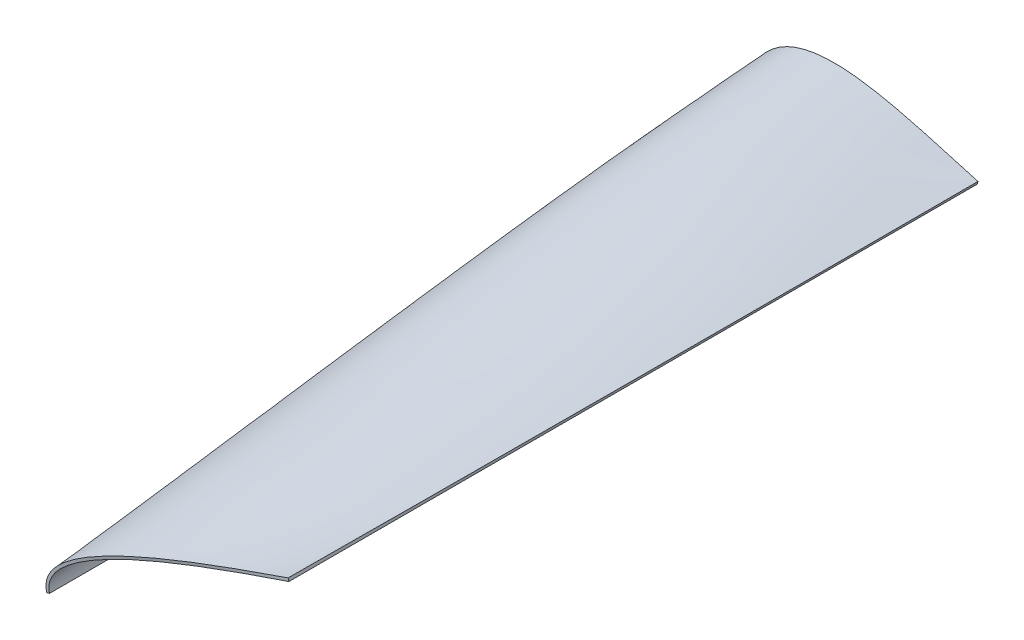
ISO-10303-21;
HEADER;
FILE_DESCRIPTION(('STEP AP214'),'2;1');
FILE_NAME('part.step','',(''),(''),'','','');
FILE_SCHEMA(('AUTOMOTIVE_DESIGN { 1 0 10303 214 1 1 1 1 }'));
ENDSEC;
DATA;
#1=APPLICATION_CONTEXT('core data for automotive mechanical design processes');
#2=APPLICATION_PROTOCOL_DEFINITION('international standard','automotive_design',2000,#1);
#3=PRODUCT_CONTEXT('',#1,'mechanical');
#4=PRODUCT('Part','Part','',(#3));
#5=PRODUCT_RELATED_PRODUCT_CATEGORY('part','',(#4));
#6=PRODUCT_DEFINITION_FORMATION('','',#4);
#7=PRODUCT_DEFINITION_CONTEXT('part definition',#1,'design');
#8=PRODUCT_DEFINITION('design','',#6,#7);
#9=PRODUCT_DEFINITION_SHAPE('','',#8);
#10=(LENGTH_UNIT() NAMED_UNIT(*) SI_UNIT(.MILLI.,.METRE.));
#11=(NAMED_UNIT(*) PLANE_ANGLE_UNIT() SI_UNIT($,.RADIAN.));
#12=(NAMED_UNIT(*) SI_UNIT($,.STERADIAN.) SOLID_ANGLE_UNIT());
#13=UNCERTAINTY_MEASURE_WITH_UNIT(LENGTH_MEASURE(1.E-05),#10,'distance_accuracy_value','');
#14=(GEOMETRIC_REPRESENTATION_CONTEXT(3) GLOBAL_UNCERTAINTY_ASSIGNED_CONTEXT((#13)) GLOBAL_UNIT_ASSIGNED_CONTEXT((#10,
#11,#12)) REPRESENTATION_CONTEXT('',''));
#15=CARTESIAN_POINT('',(0.,0.,0.));
#16=DIRECTION('',(0.,0.,1.));
#17=DIRECTION('',(1.,0.,0.));
#18=AXIS2_PLACEMENT_3D('',#15,#16,#17);
#19=CARTESIAN_POINT('',(-21.5703543383679,142.147271521122,-302.666399976954));
#20=CARTESIAN_POINT('',(-34.6379442944919,145.778481945039,-302.68171919842));
#21=CARTESIAN_POINT('',(-47.8984481119462,149.691166324391,-302.684402516985));
#22=CARTESIAN_POINT('',(-74.2739086479034,157.086445241003,-302.672750535291));
#23=CARTESIAN_POINT('',(-87.3885010336553,160.569144384547,-302.658346675289));
#24=CARTESIAN_POINT('',(-112.958912081565,166.104165839594,-302.619355876478));
#25=CARTESIAN_POINT('',(-125.414755291034,168.157643668795,-302.594584727172));
#26=CARTESIAN_POINT('',(-149.179131065414,169.810812837228,-302.543688904268));
#27=CARTESIAN_POINT('',(-160.49202638516,169.412318356151,-302.517212198902));
#28=CARTESIAN_POINT('',(-176.221440925477,166.149995853284,-302.491011368182));
#29=CARTESIAN_POINT('',(-181.257265517725,164.617264562291,-302.48470924615));
#30=CARTESIAN_POINT('',(-190.828711132257,160.521558617791,-302.480157210323));
#31=CARTESIAN_POINT('',(-195.363849835058,157.957925657709,-302.482019186262));
#32=CARTESIAN_POINT('',(-203.831139943577,151.679078878156,-302.494653391624));
#33=CARTESIAN_POINT('',(-207.762220303913,147.964287289859,-302.505405681162));
#34=CARTESIAN_POINT('',(-214.927434255557,139.289200302421,-302.532090198507));
#35=CARTESIAN_POINT('',(-218.161614709029,134.329903135347,-302.54787769888));
#36=CARTESIAN_POINT('',(-223.868648680616,123.073231982809,-302.579238773807));
#37=CARTESIAN_POINT('',(-226.342177363842,116.77597896544,-302.594762492178));
#38=CARTESIAN_POINT('',(-230.478364929651,102.731699743051,-302.622122827371));
#39=CARTESIAN_POINT('',(-232.141315772318,94.9843557699155,-302.633987501816));
#40=CARTESIAN_POINT('',(-235.836099909466,69.3796487371145,-302.661867888903));
#41=CARTESIAN_POINT('',(-236.575949617947,49.1588455525814,-302.670119397055));
#42=CARTESIAN_POINT('',(-235.353078570593,25.2699943249526,-302.666399976954));
#43=CARTESIAN_POINT('',(-22.2504000000002,139.7,-302.666399976954));
#44=CARTESIAN_POINT('',(-35.3441000000002,143.338465859985,-302.666399976954));
#45=CARTESIAN_POINT('',(-48.6065252150002,147.251806536714,-302.666399976954));
#46=CARTESIAN_POINT('',(-74.9372712261601,154.634490264004,-302.666399976954));
#47=CARTESIAN_POINT('',(-88.0055920223201,158.103833314565,-302.666399976954));
#48=CARTESIAN_POINT('',(-113.41657434696,163.604774529859,-302.666399976954));
#49=CARTESIAN_POINT('',(-125.75923587544,165.636372694592,-302.666399976954));
#50=CARTESIAN_POINT('',(-149.18734481588,167.268076878574,-302.666399976954));
#51=CARTESIAN_POINT('',(-160.272792227839,166.868182897823,-302.666399976954));
#52=CARTESIAN_POINT('',(-175.559386621759,163.699412372838,-302.666399976954));
#53=CARTESIAN_POINT('',(-180.431321965729,162.215000605533,-302.666399976954));
#54=CARTESIAN_POINT('',(-189.661556056224,158.265648812181,-302.666399976954));
#55=CARTESIAN_POINT('',(-194.019854802749,155.800708786133,-302.666399976954));
#56=CARTESIAN_POINT('',(-202.156371342248,149.766082067838,-302.666399976954));
#57=CARTESIAN_POINT('',(-205.934589135223,146.19639537559,-302.666399976954));
#58=CARTESIAN_POINT('',(-212.844499411518,137.828056917436,-302.666399976954));
#59=CARTESIAN_POINT('',(-215.976191894838,133.029405151531,-302.666399976954));
#60=CARTESIAN_POINT('',(-221.526607195717,122.078918138604,-302.666399976954));
#61=CARTESIAN_POINT('',(-223.945330013277,115.927082891584,-302.666399976954));
#62=CARTESIAN_POINT('',(-228.003361626532,102.146010508971,-302.666399976954));
#63=CARTESIAN_POINT('',(-229.642670422226,94.5167733733782,-302.666399976954));
#64=CARTESIAN_POINT('',(-233.291809242356,69.2266315225561,-302.666399976954));
#65=CARTESIAN_POINT('',(-234.032851699835,49.1632963632824,-302.666399976954));
#66=CARTESIAN_POINT('',(-232.816399976954,25.3998469821209,-302.666399976954));
#67=B_SPLINE_SURFACE_WITH_KNOTS('',1,3,((#19,#20,#21,#22,#23,#24,#25,#26,#27,#28,#29,#30,#31,
#32,#33,#34,#35,#36,#37,#38,#39,#40,#41,#42),(#43,#44,#45,#46,#47,#48,#49,#50,#51,#52,#53,#54,
#55,#56,#57,#58,#59,#60,#61,#62,#63,#64,#65,#66)),.UNSPECIFIED.,.F.,.F.,.F.,(2,2),(4,2,2,2,2,2,
2,2,2,2,2,4),(0.,1.),(0.,0.125,0.25,0.375,0.5,0.5625,0.625,0.6875,0.75,0.8125,0.875,1.),.UNSPECIFIED.);
#68=CARTESIAN_POINT('',(-232.816399976954,25.3998469821209,-302.666399976954));
#69=CARTESIAN_POINT('',(-235.353078570593,25.2699943249526,-302.666399976954));
#70=B_SPLINE_CURVE_WITH_KNOTS('',1,(#68,#69),.UNSPECIFIED.,.F.,.F.,(2,2),(0.,1.),.UNSPECIFIED.);
#71=CARTESIAN_POINT('',(-232.816399976954,25.3998469821209,-302.666399976954));
#72=VERTEX_POINT('',#71);
#73=CARTESIAN_POINT('',(-235.353078570591,25.2699943249053,-302.666399673481));
#74=VERTEX_POINT('',#73);
#75=EDGE_CURVE('E11',#72,#74,#70,.T.);
#76=CARTESIAN_POINT('',(-21.570354338229,142.147271521084,-302.666399976954));
#77=CARTESIAN_POINT('',(-28.1515271689582,143.976495440068,-302.674030743129));
#78=CARTESIAN_POINT('',(-34.7179403141286,145.857867430173,-302.678530870977));
#79=CARTESIAN_POINT('',(-47.8807085986818,149.637466294367,-302.682279540574));
#80=CARTESIAN_POINT('',(-54.477053098822,151.535730599531,-302.681502288455));
#81=CARTESIAN_POINT('',(-64.3735236202122,154.310515937094,-302.677121266817));
#82=CARTESIAN_POINT('',(-67.6640308473868,155.221046226294,-302.675134462465));
#83=CARTESIAN_POINT('',(-74.2279956559938,156.999467682348,-302.670189643876));
#84=CARTESIAN_POINT('',(-77.5013755074153,157.867644441551,-302.667239625186));
#85=CARTESIAN_POINT('',(-84.0231229646975,159.545557774948,-302.660477457022));
#86=CARTESIAN_POINT('',(-87.2713465844829,160.355850615066,-302.656675588521));
#87=CARTESIAN_POINT('',(-93.734924049595,161.902038056736,-302.648314306751));
#88=CARTESIAN_POINT('',(-96.9500560265794,162.638853747675,-302.643766894493));
#89=CARTESIAN_POINT('',(-103.339707411993,164.021977449154,-302.634023565075));
#90=CARTESIAN_POINT('',(-106.513924864185,164.669668396209,-302.628840699683));
#91=CARTESIAN_POINT('',(-112.814103208744,165.858241876281,-302.617942992689));
#92=CARTESIAN_POINT('',(-115.939693754174,166.401066559901,-302.612241465553));
#93=CARTESIAN_POINT('',(-122.135099721653,167.363382830458,-302.600436705182));
#94=CARTESIAN_POINT('',(-125.204505973749,167.785466272987,-302.594346014904));
#95=CARTESIAN_POINT('',(-131.279974076491,168.489490359195,-302.581915687265));
#96=CARTESIAN_POINT('',(-134.285644985696,168.774743294921,-302.575586420472));
#97=CARTESIAN_POINT('',(-140.226475467274,169.188025057428,-302.562862337231));
#98=CARTESIAN_POINT('',(-143.161333592877,169.320112683413,-302.556473967145));
#99=CARTESIAN_POINT('',(-147.534810427815,169.387611388077,-302.546952408716));
#100=CARTESIAN_POINT('',(-148.972523858132,169.388997566286,-302.543822066505));
#101=CARTESIAN_POINT('',(-151.827264697004,169.346448898251,-302.537638708782));
#102=CARTESIAN_POINT('',(-153.244300555704,169.30314679562,-302.53458522391));
#103=CARTESIAN_POINT('',(-156.056653818734,169.16905786836,-302.52859302251));
#104=CARTESIAN_POINT('',(-157.452002184418,169.078931464787,-302.525653305647));
#105=CARTESIAN_POINT('',(-160.219964954326,168.848995232738,-302.519930417883));
#106=CARTESIAN_POINT('',(-161.592634875499,168.709862214356,-302.517145684809));
#107=CARTESIAN_POINT('',(-164.314174286263,168.37970816483,-302.511778450989));
#108=CARTESIAN_POINT('',(-165.663125323643,168.189365119325,-302.509193839199));
#109=CARTESIAN_POINT('',(-168.336115420328,167.754582402514,-302.504276137281));
#110=CARTESIAN_POINT('',(-169.660261154756,167.51080291948,-302.501940454236));
#111=CARTESIAN_POINT('',(-172.282470782136,166.966947877111,-302.497572611923));
#112=CARTESIAN_POINT('',(-173.580662501815,166.667491893142,-302.49553751658));
#113=CARTESIAN_POINT('',(-176.149729078587,166.010108652929,-302.491824125044));
#114=CARTESIAN_POINT('',(-177.420744770808,165.652734133805,-302.490142771278));
#115=CARTESIAN_POINT('',(-179.934155116276,164.877381347602,-302.487189306491));
#116=CARTESIAN_POINT('',(-181.176690311789,164.459860259684,-302.485914322585));
#117=CARTESIAN_POINT('',(-183.631764178,163.562148500975,-302.483822430741));
#118=CARTESIAN_POINT('',(-184.844423878043,163.082289718913,-302.483003210374));
#119=CARTESIAN_POINT('',(-187.238318106274,162.057917608076,-302.481864784333));
#120=CARTESIAN_POINT('',(-188.419628611865,161.513582262926,-302.481544235194));
#121=CARTESIAN_POINT('',(-190.749319355954,160.358404705273,-302.481434479016));
#122=CARTESIAN_POINT('',(-191.897699115007,159.747561525091,-302.48164527971));
#123=CARTESIAN_POINT('',(-194.160117201985,158.457548175063,-302.482615943485));
#124=CARTESIAN_POINT('',(-195.27404263644,157.778179253331,-302.48337744566));
#125=CARTESIAN_POINT('',(-196.915102663379,156.708627531018,-302.484928671714));
#126=CARTESIAN_POINT('',(-197.458287905111,156.34285192244,-302.485515616226));
#127=CARTESIAN_POINT('',(-198.535491727498,155.593598447607,-302.48682522678));
#128=CARTESIAN_POINT('',(-199.06946615997,155.210056955029,-302.487548414543));
#129=CARTESIAN_POINT('',(-200.128033884898,154.425086116746,-302.489127908739));
#130=CARTESIAN_POINT('',(-200.652570510838,154.023580399951,-302.489984831678));
#131=CARTESIAN_POINT('',(-201.692085008512,153.202488276479,-302.491827947993));
#132=CARTESIAN_POINT('',(-202.206992753349,152.782813078617,-302.49281483956));
#133=CARTESIAN_POINT('',(-203.22706769484,151.925198790868,-302.494912953808));
#134=CARTESIAN_POINT('',(-203.732150273524,151.487159068631,-302.496024939885));
#135=CARTESIAN_POINT('',(-204.732401013345,150.592636753696,-302.498367241742));
#136=CARTESIAN_POINT('',(-205.227469218151,150.136042408783,-302.499598365994));
#137=CARTESIAN_POINT('',(-206.207523342109,149.204235730809,-302.5021719766));
#138=CARTESIAN_POINT('',(-206.692393249105,148.728901401675,-302.503515293589));
#139=CARTESIAN_POINT('',(-207.651888789819,147.759444597161,-302.506305455061));
#140=CARTESIAN_POINT('',(-208.12638179478,147.265190909894,-302.507753127305));
#141=CARTESIAN_POINT('',(-209.064973310508,146.257719621587,-302.510743440321));
#142=CARTESIAN_POINT('',(-209.52892224436,145.744362642501,-302.512286879953));
#143=CARTESIAN_POINT('',(-210.446265734094,144.698538278745,-302.515459511322));
#144=CARTESIAN_POINT('',(-210.899493397413,144.165924853698,-302.517089446064));
#145=CARTESIAN_POINT('',(-212.25125207393,142.529304103059,-302.522123608961));
#146=CARTESIAN_POINT('',(-213.124974654749,141.404656140444,-302.525617591834));
#147=CARTESIAN_POINT('',(-214.829335527507,139.077464493877,-302.532827258005));
#148=CARTESIAN_POINT('',(-215.658228367984,137.873648389302,-302.536546358643));
#149=CARTESIAN_POINT('',(-217.272227194888,135.386631893191,-302.544126379026));
#150=CARTESIAN_POINT('',(-218.055338157463,134.102138960911,-302.54798826087));
#151=CARTESIAN_POINT('',(-219.577032728655,131.452301562523,-302.555777042421));
#152=CARTESIAN_POINT('',(-220.31339466693,130.08568509859,-302.55970207796));
#153=CARTESIAN_POINT('',(-221.740927233305,127.269996621552,-302.567546600095));
#154=CARTESIAN_POINT('',(-222.429682986526,125.819704015893,-302.57146128293));
#155=CARTESIAN_POINT('',(-223.761349033302,122.834963738455,-302.579222280087));
#156=CARTESIAN_POINT('',(-224.4016870192,121.299372395366,-302.583060952266));
#157=CARTESIAN_POINT('',(-225.635861416234,118.142235546535,-302.590615597656));
#158=CARTESIAN_POINT('',(-226.227005248711,116.519641457989,-302.594321361472));
#159=CARTESIAN_POINT('',(-227.362112527902,113.186616107722,-302.601564303921));
#160=CARTESIAN_POINT('',(-227.903299049197,111.475243061034,-302.605089085898));
#161=CARTESIAN_POINT('',(-228.937779184547,107.962706674518,-302.611932077));
#162=CARTESIAN_POINT('',(-229.428244808648,106.16071425143,-302.615236134934));
#163=CARTESIAN_POINT('',(-230.360529372285,102.464931769814,-302.621606731772));
#164=CARTESIAN_POINT('',(-230.799498848403,100.570426526175,-302.62465780384));
#165=CARTESIAN_POINT('',(-231.627994861899,96.6875696054335,-302.630497538154));
#166=CARTESIAN_POINT('',(-232.014675965324,94.6986141226066,-302.633269830215));
#167=CARTESIAN_POINT('',(-232.737750912977,90.6247849584439,-302.638532130641));
#168=CARTESIAN_POINT('',(-233.071324353578,88.5394139482742,-302.641005229454));
#169=CARTESIAN_POINT('',(-233.687317410667,84.270646128162,-302.645653443172));
#170=CARTESIAN_POINT('',(-233.966959580368,82.0868508124648,-302.647811421024));
#171=CARTESIAN_POINT('',(-234.474112052662,77.6191921422312,-302.651816582918));
#172=CARTESIAN_POINT('',(-234.698898081062,75.335024400172,-302.653646637154));
#173=CARTESIAN_POINT('',(-235.306625619038,68.180082352447,-302.658763649393));
#174=CARTESIAN_POINT('',(-235.5816894934,63.2998880086463,-302.66136345047));
#175=CARTESIAN_POINT('',(-235.831478893304,55.8201565065412,-302.66424288353));
#176=CARTESIAN_POINT('',(-235.886526332428,53.2226407785666,-302.665038911483));
#177=CARTESIAN_POINT('',(-235.940521396222,47.9189779649093,-302.666289524899));
#178=CARTESIAN_POINT('',(-235.93704253492,45.212802495928,-302.666728545772));
#179=CARTESIAN_POINT('',(-235.873049754699,39.6899142744737,-302.667260605406));
#180=CARTESIAN_POINT('',(-235.810196346553,36.8732321550758,-302.667338674458));
#181=CARTESIAN_POINT('',(-235.6262010207,31.1271635870187,-302.667142971051));
#182=CARTESIAN_POINT('',(-235.502794166286,28.1978486772114,-302.666854771482));
#183=CARTESIAN_POINT('',(-235.353078570599,25.2699943250684,-302.666399976954));
#184=B_SPLINE_CURVE_WITH_KNOTS('',3,(#76,#77,#78,#79,#80,#81,#82,#83,#84,#85,#86,#87,#88,#89,
#90,#91,#92,#93,#94,#95,#96,#97,#98,#99,#100,#101,#102,#103,#104,#105,#106,#107,#108,#109,#110,
#111,#112,#113,#114,#115,#116,#117,#118,#119,#120,#121,#122,#123,#124,#125,#126,#127,#128,#129,
#130,#131,#132,#133,#134,#135,#136,#137,#138,#139,#140,#141,#142,#143,#144,#145,#146,#147,#148,
#149,#150,#151,#152,#153,#154,#155,#156,#157,#158,#159,#160,#161,#162,#163,#164,#165,#166,#167,
#168,#169,#170,#171,#172,#173,#174,#175,#176,#177,#178,#179,#180,#181,#182,#183),.UNSPECIFIED.,
.F.,.F.,(4,2,2,2,2,2,2,2,2,2,2,2,2,2,2,2,2,2,2,2,2,2,2,2,2,2,2,2,2,2,2,2,2,2,2,2,2,2,2,2,2,2,2,
2,2,2,2,2,2,2,2,2,2,4),(0.,20.4917542116613,41.0837363315129,51.3260833189101,61.4854836935867,
71.5283095602432,81.4230028098344,91.1407457794261,100.65626811341,109.948826903545,
119.003397953465,127.812109865124,132.124670864411,136.376996869383,140.570912856896,
144.70904347406,148.79487619184,152.832820815003,156.828262499044,160.787605103794,
164.718301612262,168.628868527508,172.528881670271,176.428951565159,180.340677554491,
182.305013642671,184.277030617069,186.258422625672,188.25092947607,190.256332961964,
192.276452970803,194.313143404872,196.36828794251,198.443795684551,200.541596721008,
204.81142425505,209.193931035892,213.70486769957,218.359910651232,223.174548145739,
228.163984652875,233.343065397137,238.726221264908,244.327432855642,250.160211461947,
256.237594203559,262.572150388845,269.175996295084,276.060815875272,290.716895744462,
298.510796254495,306.628598154105,315.080216928534,323.875293751985),.UNSPECIFIED.);
#185=CARTESIAN_POINT('',(-21.5703543383679,142.147271521122,-302.666399976954));
#186=VERTEX_POINT('',#185);
#187=EDGE_CURVE('E164',#186,#74,#184,.T.);
#188=CARTESIAN_POINT('',(-22.2504000000002,139.7,-302.666399976954));
#189=CARTESIAN_POINT('',(-21.5703543383679,142.147271521122,-302.666399976954));
#190=B_SPLINE_CURVE_WITH_KNOTS('',1,(#188,#189),.UNSPECIFIED.,.F.,.F.,(2,2),(0.,1.),.UNSPECIFIED.);
#191=CARTESIAN_POINT('',(-22.2504000000002,139.7,-302.666399976954));
#192=VERTEX_POINT('',#191);
#193=EDGE_CURVE('E49',#192,#186,#190,.T.);
#194=CARTESIAN_POINT('',(-22.2504000000002,139.7,-302.666399976954));
#195=CARTESIAN_POINT('',(-35.3441000000002,143.338465859985,-302.666399976954));
#196=CARTESIAN_POINT('',(-48.6065252150002,147.251806536714,-302.666399976954));
#197=CARTESIAN_POINT('',(-74.9372712261601,154.634490264004,-302.666399976954));
#198=CARTESIAN_POINT('',(-88.0055920223201,158.103833314565,-302.666399976954));
#199=CARTESIAN_POINT('',(-113.41657434696,163.604774529859,-302.666399976954));
#200=CARTESIAN_POINT('',(-125.75923587544,165.636372694592,-302.666399976954));
#201=CARTESIAN_POINT('',(-149.18734481588,167.268076878574,-302.666399976954));
#202=CARTESIAN_POINT('',(-160.272792227839,166.868182897823,-302.666399976954));
#203=CARTESIAN_POINT('',(-175.559386621759,163.699412372838,-302.666399976954));
#204=CARTESIAN_POINT('',(-180.431321965729,162.215000605533,-302.666399976954));
#205=CARTESIAN_POINT('',(-189.661556056224,158.265648812181,-302.666399976954));
#206=CARTESIAN_POINT('',(-194.019854802749,155.800708786133,-302.666399976954));
#207=CARTESIAN_POINT('',(-202.156371342248,149.766082067838,-302.666399976954));
#208=CARTESIAN_POINT('',(-205.934589135223,146.19639537559,-302.666399976954));
#209=CARTESIAN_POINT('',(-212.844499411518,137.828056917436,-302.666399976954));
#210=CARTESIAN_POINT('',(-215.976191894838,133.029405151531,-302.666399976954));
#211=CARTESIAN_POINT('',(-221.526607195717,122.078918138604,-302.666399976954));
#212=CARTESIAN_POINT('',(-223.945330013277,115.927082891584,-302.666399976954));
#213=CARTESIAN_POINT('',(-228.003361626532,102.146010508971,-302.666399976954));
#214=CARTESIAN_POINT('',(-229.642670422226,94.5167733733782,-302.666399976954));
#215=CARTESIAN_POINT('',(-233.291809242356,69.2266315225561,-302.666399976954));
#216=CARTESIAN_POINT('',(-234.032851699835,49.1632963632824,-302.666399976954));
#217=CARTESIAN_POINT('',(-232.816399976954,25.3998469821209,-302.666399976954));
#218=B_SPLINE_CURVE_WITH_KNOTS('',3,(#194,#195,#196,#197,#198,#199,#200,#201,#202,#203,#204,
#205,#206,#207,#208,#209,#210,#211,#212,#213,#214,#215,#216,#217),.UNSPECIFIED.,.F.,.F.,(4,2,2,
2,2,2,2,2,2,2,2,4),(0.,0.125,0.25,0.375,0.5,0.5625,0.625,0.6875,0.75,0.8125,0.875,1.),.UNSPECIFIED.);
#219=EDGE_CURVE('E86',#192,#72,#218,.T.);
#220=ORIENTED_EDGE('',*,*,#75,.T.);
#221=ORIENTED_EDGE('',*,*,#187,.F.);
#222=ORIENTED_EDGE('',*,*,#193,.F.);
#223=ORIENTED_EDGE('',*,*,#219,.T.);
#224=EDGE_LOOP('',(#220,#221,#222,#223));
#225=FACE_BOUND('',#224,.T.);
#226=ADVANCED_FACE('F35',(#225),#67,.T.);
#227=CARTESIAN_POINT('',(-23.0602363140462,142.107439541183,302.666399976954));
#228=CARTESIAN_POINT('',(-22.8749076515093,142.169782074979,277.444200043144));
#229=CARTESIAN_POINT('',(-22.6660220007973,142.211729233095,252.221999980795));
#230=CARTESIAN_POINT('',(-22.4077320832571,142.236597713979,214.388699983676));
#231=CARTESIAN_POINT('',(-22.3324755853175,142.239474991288,201.777599984636));
#232=CARTESIAN_POINT('',(-22.2048915390776,142.240393397304,176.555399986557));
#233=CARTESIAN_POINT('',(-22.1514886776684,142.238512631168,163.944299987517));
#234=CARTESIAN_POINT('',(-22.0100598992593,142.230366761778,126.110999990397));
#235=CARTESIAN_POINT('',(-21.9365270091514,142.221563318041,100.888799992318));
#236=CARTESIAN_POINT('',(-21.7940023756961,142.199699787935,50.4443999961589));
#237=CARTESIAN_POINT('',(-21.7304983259993,142.186811164538,25.2221999980794));
#238=CARTESIAN_POINT('',(-21.6250709290468,142.162415698399,-25.2221999980796));
#239=CARTESIAN_POINT('',(-21.5826042996333,142.150885296001,-50.444399996159));
#240=CARTESIAN_POINT('',(-21.5162953801135,142.13184708373,-100.888799992318));
#241=CARTESIAN_POINT('',(-21.4925800363931,142.124335777198,-126.110999990398));
#242=CARTESIAN_POINT('',(-21.4646965885102,142.115502096985,-201.777599984636));
#243=CARTESIAN_POINT('',(-21.5155675980368,142.132047429821,-252.221998367727));
#244=CARTESIAN_POINT('',(-21.5703543383679,142.147271521122,-302.666399976954));
#245=CARTESIAN_POINT('',(-22.2504000000002,139.7,302.666399976954));
#246=CARTESIAN_POINT('',(-22.2504000000002,139.7,277.444199978875));
#247=CARTESIAN_POINT('',(-22.2504000000002,139.7,252.221999980795));
#248=CARTESIAN_POINT('',(-22.2504000000002,139.7,214.388699983676));
#249=CARTESIAN_POINT('',(-22.2504000000002,139.7,201.777599984636));
#250=CARTESIAN_POINT('',(-22.2504000000002,139.7,176.555399986557));
#251=CARTESIAN_POINT('',(-22.2504000000002,139.7,163.944299987517));
#252=CARTESIAN_POINT('',(-22.2504000000002,139.7,126.110999990397));
#253=CARTESIAN_POINT('',(-22.2504000000002,139.7,100.888799992318));
#254=CARTESIAN_POINT('',(-22.2504000000002,139.7,50.4443999961589));
#255=CARTESIAN_POINT('',(-22.2504000000002,139.7,25.2221999980794));
#256=CARTESIAN_POINT('',(-22.2504000000002,139.7,-25.2221999980796));
#257=CARTESIAN_POINT('',(-22.2504000000002,139.7,-50.444399996159));
#258=CARTESIAN_POINT('',(-22.2504000000002,139.7,-100.888799992318));
#259=CARTESIAN_POINT('',(-22.2504000000002,139.7,-126.110999990398));
#260=CARTESIAN_POINT('',(-22.2504000000002,139.7,-201.777599984636));
#261=CARTESIAN_POINT('',(-22.2504000000002,139.7,-252.221999980795));
#262=CARTESIAN_POINT('',(-22.2504000000002,139.7,-302.666399976954));
#263=B_SPLINE_SURFACE_WITH_KNOTS('',1,3,((#227,#228,#229,#230,#231,#232,#233,#234,#235,#236,
#237,#238,#239,#240,#241,#242,#243,#244),(#245,#246,#247,#248,#249,#250,#251,#252,#253,#254,
#255,#256,#257,#258,#259,#260,#261,#262)),.UNSPECIFIED.,.F.,.F.,.F.,(2,2),(4,2,2,2,2,2,2,2,4),
(0.,1.),(-0.302178200077143,-0.226511600082904,-0.188678300085785,-0.150845000088666,
-0.0751784000944271,0.000488199899811359,0.0761547998940499,0.151821399888288,
0.303154599876765),.UNSPECIFIED.);
#264=CARTESIAN_POINT('',(-23.0602363139507,142.107439541216,302.66639997694));
#265=CARTESIAN_POINT('',(-23.0141659804694,142.123012839073,296.389445739226));
#266=CARTESIAN_POINT('',(-22.9666536636085,142.137449410609,290.112499481347));
#267=CARTESIAN_POINT('',(-22.8705269459327,142.163620557668,277.557566972912));
#268=CARTESIAN_POINT('',(-22.8219123633534,142.175354683945,271.279580722807));
#269=CARTESIAN_POINT('',(-22.7253635819106,142.195690288017,258.72152819007));
#270=CARTESIAN_POINT('',(-22.6774296126146,142.204290731877,252.441461903966));
#271=CARTESIAN_POINT('',(-22.5842051254512,142.218410781955,239.878208979004));
#272=CARTESIAN_POINT('',(-22.5389159227935,142.223928866841,233.595022328561));
#273=CARTESIAN_POINT('',(-22.4529774462454,142.232277943526,221.024488820539));
#274=CARTESIAN_POINT('',(-22.4123312388326,142.235107168387,214.737141940525));
#275=CARTESIAN_POINT('',(-22.3371776894164,142.238800980762,202.157726303115));
#276=CARTESIAN_POINT('',(-22.3026749438188,142.239664102928,195.865657517849));
#277=CARTESIAN_POINT('',(-22.2387973506406,142.240173075178,183.277487692583));
#278=CARTESIAN_POINT('',(-22.2094257822582,142.239818149811,176.981386636184));
#279=CARTESIAN_POINT('',(-22.1548544082145,142.238347102662,164.386038916019));
#280=CARTESIAN_POINT('',(-22.1296566822154,142.237230602828,158.08679224337));
#281=CARTESIAN_POINT('',(-22.05880528855,142.233221796554,139.183176054423));
#282=CARTESIAN_POINT('',(-22.017921273759,142.229670609542,126.578789281787));
#283=CARTESIAN_POINT('',(-21.9396443128188,142.221200237573,101.367205873382));
#284=CARTESIAN_POINT('',(-21.9022521443721,142.216280748835,88.7600092355508));
#285=CARTESIAN_POINT('',(-21.8310209874548,142.205402486255,63.5436352543985));
#286=CARTESIAN_POINT('',(-21.7971825553272,142.199443550073,50.9344579095206));
#287=CARTESIAN_POINT('',(-21.7342967703928,142.187220408056,25.7129221911757));
#288=CARTESIAN_POINT('',(-21.7052506239043,142.180956125872,13.1005638147273));
#289=CARTESIAN_POINT('',(-21.652353585401,142.168741176754,-12.128101207391));
#290=CARTESIAN_POINT('',(-21.6285043180155,142.162790608332,-24.7444078565194));
#291=CARTESIAN_POINT('',(-21.5856612657263,142.15157322414,-49.981045264637));
#292=CARTESIAN_POINT('',(-21.5666690286765,142.146306626602,-62.601376026332));
#293=CARTESIAN_POINT('',(-21.5333967504556,142.136760405441,-87.8461930516355));
#294=CARTESIAN_POINT('',(-21.5191182604379,142.132481106848,-100.470679317433));
#295=CARTESIAN_POINT('',(-21.49644742343,142.12555131673,-125.724365105413));
#296=CARTESIAN_POINT('',(-21.4880572731537,142.122901433124,-138.353564629849));
#297=CARTESIAN_POINT('',(-21.478772006958,142.119962785036,-163.617297192011));
#298=CARTESIAN_POINT('',(-21.477880055879,142.119675017558,-176.251830231107));
#299=CARTESIAN_POINT('',(-21.4833691639568,142.121418184463,-201.525818581657));
#300=CARTESIAN_POINT('',(-21.4897530579254,142.123450022611,-214.165273892302));
#301=CARTESIAN_POINT('',(-21.5072137467272,142.128857234269,-239.447509666045));
#302=CARTESIAN_POINT('',(-21.518291777187,142.132232961513,-252.090290128097));
#303=CARTESIAN_POINT('',(-21.5429723463344,142.139536374896,-277.377513905177));
#304=CARTESIAN_POINT('',(-21.556575217376,142.143464133683,-290.02195721987));
#305=CARTESIAN_POINT('',(-21.570354338229,142.147271521084,-302.666399976954));
#306=B_SPLINE_CURVE_WITH_KNOTS('',3,(#264,#265,#266,#267,#268,#269,#270,#271,#272,#273,#274,
#275,#276,#277,#278,#279,#280,#281,#282,#283,#284,#285,#286,#287,#288,#289,#290,#291,#292,#293,
#294,#295,#296,#297,#298,#299,#300,#301,#302,#303,#304,#305),.UNSPECIFIED.,.F.,.F.,(4,2,2,2,2,2,
2,2,2,2,2,2,2,2,2,2,2,2,2,2,4),(0.,18.8314273977612,37.6659830288781,56.5067473667531,
75.3568025675662,94.2192362198521,113.095723576012,131.984230608384,150.882120916663,
188.695478465097,226.517237801241,264.344909393494,302.182088519142,340.031079248937,
377.89211682696,415.765600950572,453.653206719768,491.556803289278,529.4751728929,
567.403529866818,605.336883033225),.UNSPECIFIED.);
#307=CARTESIAN_POINT('',(-23.0602363140462,142.107439541183,302.666399976954));
#308=VERTEX_POINT('',#307);
#309=EDGE_CURVE('E161',#308,#186,#306,.T.);
#310=CARTESIAN_POINT('',(-22.2504000000002,139.7,302.666399976954));
#311=CARTESIAN_POINT('',(-23.0602363140462,142.107439541183,302.666399976954));
#312=B_SPLINE_CURVE_WITH_KNOTS('',1,(#310,#311),.UNSPECIFIED.,.F.,.F.,(2,2),(0.,1.),.UNSPECIFIED.);
#313=CARTESIAN_POINT('',(-22.2504000000002,139.7,302.666399976954));
#314=VERTEX_POINT('',#313);
#315=EDGE_CURVE('E163',#314,#308,#312,.T.);
#316=CARTESIAN_POINT('',(-22.2504000000002,139.7,302.666399976954));
#317=CARTESIAN_POINT('',(-22.2504000000002,139.7,277.444199978875));
#318=CARTESIAN_POINT('',(-22.2504000000002,139.7,252.221999980795));
#319=CARTESIAN_POINT('',(-22.2504000000002,139.7,214.388699983676));
#320=CARTESIAN_POINT('',(-22.2504000000002,139.7,201.777599984636));
#321=CARTESIAN_POINT('',(-22.2504000000002,139.7,176.555399986557));
#322=CARTESIAN_POINT('',(-22.2504000000002,139.7,163.944299987517));
#323=CARTESIAN_POINT('',(-22.2504000000002,139.7,126.110999990397));
#324=CARTESIAN_POINT('',(-22.2504000000002,139.7,100.888799992318));
#325=CARTESIAN_POINT('',(-22.2504000000002,139.7,50.4443999961589));
#326=CARTESIAN_POINT('',(-22.2504000000002,139.7,25.2221999980794));
#327=CARTESIAN_POINT('',(-22.2504000000002,139.7,-25.2221999980796));
#328=CARTESIAN_POINT('',(-22.2504000000002,139.7,-50.444399996159));
#329=CARTESIAN_POINT('',(-22.2504000000002,139.7,-100.888799992318));
#330=CARTESIAN_POINT('',(-22.2504000000002,139.7,-126.110999990398));
#331=CARTESIAN_POINT('',(-22.2504000000002,139.7,-201.777599984636));
#332=CARTESIAN_POINT('',(-22.2504000000002,139.7,-252.221999980795));
#333=CARTESIAN_POINT('',(-22.2504000000002,139.7,-302.666399976954));
#334=B_SPLINE_CURVE_WITH_KNOTS('',3,(#316,#317,#318,#319,#320,#321,#322,#323,#324,#325,#326,
#327,#328,#329,#330,#331,#332,#333),.UNSPECIFIED.,.F.,.F.,(4,2,2,2,2,2,2,2,4),
(-0.302178200077143,-0.226511600082904,-0.188678300085785,-0.150845000088666,
-0.0751784000944271,0.000488199899811359,0.0761547998940499,0.151821399888288,
0.303154599876765),.UNSPECIFIED.);
#335=EDGE_CURVE('E76',#314,#192,#334,.T.);
#336=ORIENTED_EDGE('',*,*,#193,.T.);
#337=ORIENTED_EDGE('',*,*,#309,.F.);
#338=ORIENTED_EDGE('',*,*,#315,.F.);
#339=ORIENTED_EDGE('',*,*,#335,.T.);
#340=EDGE_LOOP('',(#336,#337,#338,#339));
#341=FACE_BOUND('',#340,.T.);
#342=ADVANCED_FACE('F132',(#341),#263,.T.);
#343=CARTESIAN_POINT('',(-23.0602363140462,142.107439541183,302.666399976954));
#344=CARTESIAN_POINT('',(-49.2654744620987,133.292284224725,302.88059850577));
#345=CARTESIAN_POINT('',(-76.1472439505331,123.90953666443,303.018361825704));
#346=CARTESIAN_POINT('',(-127.047974614437,104.608824422519,303.171384349091));
#347=CARTESIAN_POINT('',(-151.063943651277,94.6914610105602,303.189003917959));
#348=CARTESIAN_POINT('',(-181.794910496814,79.7911443454916,303.148384603078));
#349=CARTESIAN_POINT('',(-191.156716119647,74.8200485621437,303.123451348564));
#350=CARTESIAN_POINT('',(-207.607322362472,64.9093300519747,303.052320578458));
#351=CARTESIAN_POINT('',(-214.696253838433,59.9729802438823,303.005951312213));
#352=CARTESIAN_POINT('',(-223.257121367787,52.5740448625444,302.922064656846));
#353=CARTESIAN_POINT('',(-225.765812957788,50.1078844610264,302.891689553289));
#354=CARTESIAN_POINT('',(-230.026436369709,45.1515311480335,302.82798207686));
#355=CARTESIAN_POINT('',(-231.779878252816,42.6607583510574,302.794444449773));
#356=CARTESIAN_POINT('',(-233.769503568031,38.8752337533089,302.746950561054));
#357=CARTESIAN_POINT('',(-234.325499982944,37.6049983725636,302.731654304482));
#358=CARTESIAN_POINT('',(-235.203434863796,35.0461990692862,302.704066543661));
#359=CARTESIAN_POINT('',(-235.525207340024,33.7574213050916,302.691794358499));
#360=CARTESIAN_POINT('',(-235.911449575914,31.1691806138741,302.672799106246));
#361=CARTESIAN_POINT('',(-235.975547813111,29.8697720164569,302.666125922247));
#362=CARTESIAN_POINT('',(-235.827931919425,27.2812143335592,302.660436140569));
#363=CARTESIAN_POINT('',(-235.616070358453,25.992556786183,302.661450764639));
#364=CARTESIAN_POINT('',(-235.264302742675,24.7220770730965,302.666399976954));
#365=CARTESIAN_POINT('',(-22.2504000000002,139.7,302.666399976954));
#366=CARTESIAN_POINT('',(-48.4378000000002,130.890845241321,302.666399976954));
#367=CARTESIAN_POINT('',(-75.3001008600001,121.539238705806,302.666399976954));
#368=CARTESIAN_POINT('',(-126.12206550928,102.296352999051,302.666399976954));
#369=CARTESIAN_POINT('',(-150.08172929856,92.4050738278127,302.666399976954));
#370=CARTESIAN_POINT('',(-180.654918086399,77.5723237826265,302.666399976954));
#371=CARTESIAN_POINT('',(-189.951596532999,72.628768552843,302.666399976954));
#372=CARTESIAN_POINT('',(-206.224629611998,62.8112015285771,302.666399976954));
#373=CARTESIAN_POINT('',(-213.200984244398,57.9371897340947,302.666399976954));
#374=CARTESIAN_POINT('',(-221.526607195717,50.7294450174048,302.666399976954));
#375=CARTESIAN_POINT('',(-223.945330013277,48.3440756076805,302.666399976954));
#376=CARTESIAN_POINT('',(-228.003361626532,43.616280346336,302.666399976954));
#377=CARTESIAN_POINT('',(-229.642670422226,41.2738544947159,302.666399976954));
#378=CARTESIAN_POINT('',(-231.467239832291,37.7988128106837,302.666399976954));
#379=CARTESIAN_POINT('',(-231.9696973384,36.6468984315726,302.666399976954));
#380=CARTESIAN_POINT('',(-232.754842211611,34.3570002752864,302.666399976954));
#381=CARTESIAN_POINT('',(-233.037529578714,33.2190164981112,302.666399976954));
#382=CARTESIAN_POINT('',(-233.374828629401,30.9580444498335,302.666399976954));
#383=CARTESIAN_POINT('',(-233.429440312986,29.8350561787309,302.666399976954));
#384=CARTESIAN_POINT('',(-233.302282452122,27.6051400467348,302.666399976954));
#385=CARTESIAN_POINT('',(-233.120512907674,26.4982121858415,302.666399976954));
#386=CARTESIAN_POINT('',(-232.816399976954,25.3998469821209,302.666399976954));
#387=B_SPLINE_SURFACE_WITH_KNOTS('',1,3,((#343,#344,#345,#346,#347,#348,#349,#350,#351,#352,
#353,#354,#355,#356,#357,#358,#359,#360,#361,#362,#363,#364),(#365,#366,#367,#368,#369,#370,
#371,#372,#373,#374,#375,#376,#377,#378,#379,#380,#381,#382,#383,#384,#385,#386)),.UNSPECIFIED.,
.F.,.F.,.F.,(2,2),(4,2,2,2,2,2,2,2,2,2,4),(0.,1.),(0.,0.25,0.5,0.625,0.75,0.8125,0.875,0.90625,
0.9375,0.96875,1.),.UNSPECIFIED.);
#388=CARTESIAN_POINT('',(-23.0602363140462,142.107439541183,302.666399976954));
#389=CARTESIAN_POINT('',(-49.2654744620987,133.292284224725,302.88059850577));
#390=CARTESIAN_POINT('',(-76.1472439505331,123.90953666443,303.018361825704));
#391=CARTESIAN_POINT('',(-127.047974614437,104.608824422519,303.171384349091));
#392=CARTESIAN_POINT('',(-151.063943651277,94.6914610105602,303.189003917959));
#393=CARTESIAN_POINT('',(-181.794910496814,79.7911443454916,303.148384603078));
#394=CARTESIAN_POINT('',(-191.156716119647,74.8200485621437,303.123451348564));
#395=CARTESIAN_POINT('',(-207.607322362472,64.9093300519747,303.052320578458));
#396=CARTESIAN_POINT('',(-214.696253838433,59.9729802438823,303.005951312213));
#397=CARTESIAN_POINT('',(-223.257121367787,52.5740448625444,302.922064656846));
#398=CARTESIAN_POINT('',(-225.765812957788,50.1078844610264,302.891689553289));
#399=CARTESIAN_POINT('',(-230.026436369709,45.1515311480335,302.82798207686));
#400=CARTESIAN_POINT('',(-231.779878252816,42.6607583510574,302.794444449773));
#401=CARTESIAN_POINT('',(-233.769503568031,38.8752337533089,302.746950561054));
#402=CARTESIAN_POINT('',(-234.325499982944,37.6049983725636,302.731654304482));
#403=CARTESIAN_POINT('',(-235.203434863796,35.0461990692862,302.704066543661));
#404=CARTESIAN_POINT('',(-235.525207340024,33.7574213050916,302.691794358499));
#405=CARTESIAN_POINT('',(-235.911449575914,31.1691806138741,302.672799106246));
#406=CARTESIAN_POINT('',(-235.975547813111,29.8697720164569,302.666125922247));
#407=CARTESIAN_POINT('',(-235.827931919425,27.2812143335592,302.660436140569));
#408=CARTESIAN_POINT('',(-235.616070358453,25.992556786183,302.661450764639));
#409=CARTESIAN_POINT('',(-235.264302742675,24.7220770730965,302.666399976954));
#410=B_SPLINE_CURVE_WITH_KNOTS('',3,(#388,#389,#390,#391,#392,#393,#394,#395,#396,#397,#398,
#399,#400,#401,#402,#403,#404,#405,#406,#407,#408,#409),.UNSPECIFIED.,.F.,.F.,(4,2,2,2,2,2,2,2,
2,2,4),(0.,0.25,0.5,0.625,0.75,0.8125,0.875,0.90625,0.9375,0.96875,1.),.UNSPECIFIED.);
#411=CARTESIAN_POINT('',(-235.264302759559,24.722077134079,302.666399976716));
#412=VERTEX_POINT('',#411);
#413=EDGE_CURVE('E275',#308,#412,#410,.T.);
#414=CARTESIAN_POINT('',(-232.816399976955,25.3998469821209,302.666399976954));
#415=CARTESIAN_POINT('',(-235.264302742675,24.7220770730965,302.666399976954));
#416=B_SPLINE_CURVE_WITH_KNOTS('',1,(#414,#415),.UNSPECIFIED.,.F.,.F.,(2,2),(0.,1.),.UNSPECIFIED.);
#417=CARTESIAN_POINT('',(-232.816399976954,25.3998469821209,302.666399976954));
#418=VERTEX_POINT('',#417);
#419=EDGE_CURVE('E277',#418,#412,#416,.T.);
#420=CARTESIAN_POINT('',(-22.2504000000002,139.7,302.666399976954));
#421=CARTESIAN_POINT('',(-127.,104.463380965285,302.666399976954));
#422=CARTESIAN_POINT('',(-242.54801376,60.5475335011777,302.666399976954));
#423=CARTESIAN_POINT('',(-232.816399976954,25.3998469821209,302.666399976954));
#424=B_SPLINE_CURVE_WITH_KNOTS('',3,(#420,#421,#422,#423),.UNSPECIFIED.,.F.,.F.,(4,4),(0.,1.),.UNSPECIFIED.);
#425=EDGE_CURVE('E89',#314,#418,#424,.T.);
#426=ORIENTED_EDGE('',*,*,#315,.T.);
#427=ORIENTED_EDGE('',*,*,#413,.T.);
#428=ORIENTED_EDGE('',*,*,#419,.F.);
#429=ORIENTED_EDGE('',*,*,#425,.F.);
#430=EDGE_LOOP('',(#426,#427,#428,#429));
#431=FACE_BOUND('',#430,.T.);
#432=ADVANCED_FACE('F235',(#431),#387,.F.);
#433=CARTESIAN_POINT('',(-235.264302742675,24.7220770730965,302.666399976954));
#434=CARTESIAN_POINT('',(-235.293529312049,24.8276347248167,277.444207488526));
#435=CARTESIAN_POINT('',(-235.305393318932,24.8906453524479,252.221999980795));
#436=CARTESIAN_POINT('',(-235.32436259054,24.9942638403017,201.777599984636));
#437=CARTESIAN_POINT('',(-235.329891106472,25.0325103522552,176.555399986556));
#438=CARTESIAN_POINT('',(-235.342290417565,25.1253057042382,100.888799992318));
#439=CARTESIAN_POINT('',(-235.345023665526,25.1583374846214,50.4443999961589));
#440=CARTESIAN_POINT('',(-235.351595157806,25.2353970562066,-100.888799992318));
#441=CARTESIAN_POINT('',(-235.352272339986,25.2542445669793,-201.777599815347));
#442=CARTESIAN_POINT('',(-235.353078570593,25.2699943249526,-302.666399976954));
#443=CARTESIAN_POINT('',(-232.816399976955,25.3998469821209,302.666399976954));
#444=CARTESIAN_POINT('',(-232.816399976955,25.3998469821209,277.444199978875));
#445=CARTESIAN_POINT('',(-232.816399976954,25.3998469821209,252.221999980795));
#446=CARTESIAN_POINT('',(-232.816399976954,25.3998469821209,201.777599984636));
#447=CARTESIAN_POINT('',(-232.816399976954,25.3998469821209,176.555399986556));
#448=CARTESIAN_POINT('',(-232.816399976954,25.3998469821209,100.888799992318));
#449=CARTESIAN_POINT('',(-232.816399976954,25.3998469821209,50.4443999961589));
#450=CARTESIAN_POINT('',(-232.816399976954,25.3998469821209,-100.888799992318));
#451=CARTESIAN_POINT('',(-232.816399976954,25.3998469821209,-201.777599984636));
#452=CARTESIAN_POINT('',(-232.816399976954,25.3998469821209,-302.666399976954));
#453=B_SPLINE_SURFACE_WITH_KNOTS('',1,3,((#433,#434,#435,#436,#437,#438,#439,#440,#441,#442),
(#443,#444,#445,#446,#447,#448,#449,#450,#451,#452)),.UNSPECIFIED.,.F.,.F.,.F.,(2,2),(4,2,2,2,
4),(0.,1.),(-0.302178200077143,-0.226511600082904,-0.150845000088666,0.000488199899811359,
0.303154599876765),.UNSPECIFIED.);
#454=CARTESIAN_POINT('',(-232.816399976954,25.3998469821209,302.666399976954));
#455=CARTESIAN_POINT('',(-232.816399976954,25.3998469821209,272.19462415422));
#456=CARTESIAN_POINT('',(-232.816399976954,25.3998469821209,207.65509299043));
#457=CARTESIAN_POINT('',(-232.816399976954,25.3998469821209,110.909358895454));
#458=CARTESIAN_POINT('',(-232.816399976954,25.3998469821209,15.8128370313269));
#459=CARTESIAN_POINT('',(-232.816399976954,25.3998469821209,-77.7213050711637));
#460=CARTESIAN_POINT('',(-232.816399976954,25.3998469821209,-182.845984980495));
#461=CARTESIAN_POINT('',(-232.816399976954,25.3998469821209,-259.09436986256));
#462=CARTESIAN_POINT('',(-232.816399976954,25.3998469821209,-302.666399976954));
#463=B_SPLINE_CURVE_WITH_KNOTS('',3,(#454,#455,#456,#457,#458,#459,#460,#461,#462),
.UNSPECIFIED.,.F.,.F.,(4,1,1,1,1,1,4),(0.,0.151708954736583,0.321321109376988,0.479681545655549,
0.623121445694604,0.784633291012482,1.),.UNSPECIFIED.);
#464=EDGE_CURVE('E82',#418,#72,#463,.T.);
#465=CARTESIAN_POINT('',(-235.264302742675,24.7220770730965,302.666399976954));
#466=CARTESIAN_POINT('',(-235.293529312049,24.8276347248167,277.444207488526));
#467=CARTESIAN_POINT('',(-235.305393318932,24.8906453524479,252.221999980795));
#468=CARTESIAN_POINT('',(-235.32436259054,24.9942638403017,201.777599984636));
#469=CARTESIAN_POINT('',(-235.329891106472,25.0325103522552,176.555399986556));
#470=CARTESIAN_POINT('',(-235.342290417565,25.1253057042382,100.888799992318));
#471=CARTESIAN_POINT('',(-235.345023665526,25.1583374846214,50.4443999961589));
#472=CARTESIAN_POINT('',(-235.351595157806,25.2353970562066,-100.888799992318));
#473=CARTESIAN_POINT('',(-235.352272339986,25.2542445669793,-201.777599815347));
#474=CARTESIAN_POINT('',(-235.353078570593,25.2699943249526,-302.666399976954));
#475=B_SPLINE_CURVE_WITH_KNOTS('',3,(#465,#466,#467,#468,#469,#470,#471,#472,#473,#474),
.UNSPECIFIED.,.F.,.F.,(4,2,2,2,4),(-0.302178200077143,-0.226511600082904,-0.150845000088666,
0.000488199899811359,0.303154599876765),.UNSPECIFIED.);
#476=EDGE_CURVE('E57',#412,#74,#475,.T.);
#477=ORIENTED_EDGE('',*,*,#464,.F.);
#478=ORIENTED_EDGE('',*,*,#419,.T.);
#479=ORIENTED_EDGE('',*,*,#476,.T.);
#480=ORIENTED_EDGE('',*,*,#75,.F.);
#481=EDGE_LOOP('',(#477,#478,#479,#480));
#482=FACE_BOUND('',#481,.T.);
#483=ADVANCED_FACE('F37',(#482),#453,.F.);
#484=CARTESIAN_POINT('',(-22.2504000000002,139.7,302.666399976954));
#485=CARTESIAN_POINT('',(-22.2504000000002,139.7,272.19462415422));
#486=CARTESIAN_POINT('',(-22.2504000000002,139.7,207.65509299043));
#487=CARTESIAN_POINT('',(-22.2504000000002,139.7,110.909358895454));
#488=CARTESIAN_POINT('',(-22.2504000000002,139.7,15.8128370313269));
#489=CARTESIAN_POINT('',(-22.2504000000002,139.7,-77.7213050711637));
#490=CARTESIAN_POINT('',(-22.2504000000002,139.7,-182.845984980495));
#491=CARTESIAN_POINT('',(-22.2504000000002,139.7,-259.09436986256));
#492=CARTESIAN_POINT('',(-22.2504000000002,139.7,-302.666399976954));
#493=CARTESIAN_POINT('',(-127.,104.463380965285,302.666399976954));
#494=CARTESIAN_POINT('',(-127.,115.307918359199,272.19462415422));
#495=CARTESIAN_POINT('',(-127.,138.276758874535,207.65509299043));
#496=CARTESIAN_POINT('',(-127.,151.687179795804,110.909358895454));
#497=CARTESIAN_POINT('',(-127.,163.002646819429,15.8128370313269));
#498=CARTESIAN_POINT('',(-127.,170.505126192973,-77.7213050711637));
#499=CARTESIAN_POINT('',(-127.,174.807939554706,-182.845984980495));
#500=CARTESIAN_POINT('',(-127.,170.989670978203,-259.09436986256));
#501=CARTESIAN_POINT('',(-127.,168.807726879878,-302.666399976954));
#502=CARTESIAN_POINT('',(-242.54801376,60.5475335011777,302.666399976954));
#503=CARTESIAN_POINT('',(-242.54801376,67.667832268243,272.19462415422));
#504=CARTESIAN_POINT('',(-242.54801376,82.7486974874489,207.65509299043));
#505=CARTESIAN_POINT('',(-242.54801376,109.254343425403,110.909358895454));
#506=CARTESIAN_POINT('',(-242.54801376,135.277152968957,15.8128370313269));
#507=CARTESIAN_POINT('',(-242.54801376,160.534914529228,-77.7213050711637));
#508=CARTESIAN_POINT('',(-242.54801376,188.050831793711,-182.845984980495));
#509=CARTESIAN_POINT('',(-242.54801376,205.522997826712,-259.09436986256));
#510=CARTESIAN_POINT('',(-242.54801376,215.507442031413,-302.666399976954));
#511=CARTESIAN_POINT('',(-232.816399976954,25.3998469821209,302.666399976954));
#512=CARTESIAN_POINT('',(-232.816399976954,25.3998469821209,272.19462415422));
#513=CARTESIAN_POINT('',(-232.816399976954,25.3998469821209,207.65509299043));
#514=CARTESIAN_POINT('',(-232.816399976954,25.3998469821209,110.909358895454));
#515=CARTESIAN_POINT('',(-232.816399976954,25.3998469821209,15.8128370313269));
#516=CARTESIAN_POINT('',(-232.816399976954,25.3998469821209,-77.7213050711637));
#517=CARTESIAN_POINT('',(-232.816399976954,25.3998469821209,-182.845984980495));
#518=CARTESIAN_POINT('',(-232.816399976954,25.3998469821209,-259.09436986256));
#519=CARTESIAN_POINT('',(-232.816399976954,25.3998469821209,-302.666399976954));
#520=B_SPLINE_SURFACE_WITH_KNOTS('',3,3,((#484,#485,#486,#487,#488,#489,#490,#491,#492),(#493,
#494,#495,#496,#497,#498,#499,#500,#501),(#502,#503,#504,#505,#506,#507,#508,#509,#510),(#511,
#512,#513,#514,#515,#516,#517,#518,#519)),.UNSPECIFIED.,.F.,.F.,.F.,(4,4),(4,1,1,1,1,1,4),(0.,
1.),(0.,0.151708954736583,0.321321109376988,0.479681545655549,0.623121445694604,
0.784633291012482,1.),.UNSPECIFIED.);
#521=OFFSET_SURFACE('',#520,-2.54,.F.);
#522=ORIENTED_EDGE('',*,*,#413,.F.);
#523=ORIENTED_EDGE('',*,*,#309,.T.);
#524=ORIENTED_EDGE('',*,*,#187,.T.);
#525=ORIENTED_EDGE('',*,*,#476,.F.);
#526=EDGE_LOOP('',(#522,#523,#524,#525));
#527=FACE_BOUND('',#526,.T.);
#528=ADVANCED_FACE('F181',(#527),#521,.F.);
#529=CARTESIAN_POINT('',(-22.2504000000002,139.7,302.666399976954));
#530=CARTESIAN_POINT('',(-22.2504000000002,139.7,272.19462415422));
#531=CARTESIAN_POINT('',(-22.2504000000002,139.7,207.65509299043));
#532=CARTESIAN_POINT('',(-22.2504000000002,139.7,110.909358895454));
#533=CARTESIAN_POINT('',(-22.2504000000002,139.7,15.8128370313269));
#534=CARTESIAN_POINT('',(-22.2504000000002,139.7,-77.7213050711637));
#535=CARTESIAN_POINT('',(-22.2504000000002,139.7,-182.845984980495));
#536=CARTESIAN_POINT('',(-22.2504000000002,139.7,-259.09436986256));
#537=CARTESIAN_POINT('',(-22.2504000000002,139.7,-302.666399976954));
#538=CARTESIAN_POINT('',(-127.,104.463380965285,302.666399976954));
#539=CARTESIAN_POINT('',(-127.,115.307918359199,272.19462415422));
#540=CARTESIAN_POINT('',(-127.,138.276758874535,207.65509299043));
#541=CARTESIAN_POINT('',(-127.,151.687179795804,110.909358895454));
#542=CARTESIAN_POINT('',(-127.,163.002646819429,15.8128370313269));
#543=CARTESIAN_POINT('',(-127.,170.505126192973,-77.7213050711637));
#544=CARTESIAN_POINT('',(-127.,174.807939554706,-182.845984980495));
#545=CARTESIAN_POINT('',(-127.,170.989670978203,-259.09436986256));
#546=CARTESIAN_POINT('',(-127.,168.807726879878,-302.666399976954));
#547=CARTESIAN_POINT('',(-242.54801376,60.5475335011777,302.666399976954));
#548=CARTESIAN_POINT('',(-242.54801376,67.667832268243,272.19462415422));
#549=CARTESIAN_POINT('',(-242.54801376,82.7486974874489,207.65509299043));
#550=CARTESIAN_POINT('',(-242.54801376,109.254343425403,110.909358895454));
#551=CARTESIAN_POINT('',(-242.54801376,135.277152968957,15.8128370313269));
#552=CARTESIAN_POINT('',(-242.54801376,160.534914529228,-77.7213050711637));
#553=CARTESIAN_POINT('',(-242.54801376,188.050831793711,-182.845984980495));
#554=CARTESIAN_POINT('',(-242.54801376,205.522997826712,-259.09436986256));
#555=CARTESIAN_POINT('',(-242.54801376,215.507442031413,-302.666399976954));
#556=CARTESIAN_POINT('',(-232.816399976954,25.3998469821209,302.666399976954));
#557=CARTESIAN_POINT('',(-232.816399976954,25.3998469821209,272.19462415422));
#558=CARTESIAN_POINT('',(-232.816399976954,25.3998469821209,207.65509299043));
#559=CARTESIAN_POINT('',(-232.816399976954,25.3998469821209,110.909358895454));
#560=CARTESIAN_POINT('',(-232.816399976954,25.3998469821209,15.8128370313269));
#561=CARTESIAN_POINT('',(-232.816399976954,25.3998469821209,-77.7213050711637));
#562=CARTESIAN_POINT('',(-232.816399976954,25.3998469821209,-182.845984980495));
#563=CARTESIAN_POINT('',(-232.816399976954,25.3998469821209,-259.09436986256));
#564=CARTESIAN_POINT('',(-232.816399976954,25.3998469821209,-302.666399976954));
#565=B_SPLINE_SURFACE_WITH_KNOTS('',3,3,((#529,#530,#531,#532,#533,#534,#535,#536,#537),(#538,
#539,#540,#541,#542,#543,#544,#545,#546),(#547,#548,#549,#550,#551,#552,#553,#554,#555),(#556,
#557,#558,#559,#560,#561,#562,#563,#564)),.UNSPECIFIED.,.F.,.F.,.F.,(4,4),(4,1,1,1,1,1,4),(0.,
1.),(0.,0.151708954736583,0.321321109376988,0.479681545655549,0.623121445694604,
0.784633291012482,1.),.UNSPECIFIED.);
#566=ORIENTED_EDGE('',*,*,#425,.T.);
#567=ORIENTED_EDGE('',*,*,#464,.T.);
#568=ORIENTED_EDGE('',*,*,#219,.F.);
#569=ORIENTED_EDGE('',*,*,#335,.F.);
#570=EDGE_LOOP('',(#566,#567,#568,#569));
#571=FACE_BOUND('',#570,.T.);
#572=ADVANCED_FACE('F85',(#571),#565,.T.);
#573=CLOSED_SHELL('',(#226,#342,#432,#483,#528,#572));
#574=MANIFOLD_SOLID_BREP('B2',#573);
#575=ADVANCED_BREP_SHAPE_REPRESENTATION('',(#18,#574),#14);
#576=SHAPE_DEFINITION_REPRESENTATION(#9,#575);
ENDSEC;
END-ISO-10303-21;
